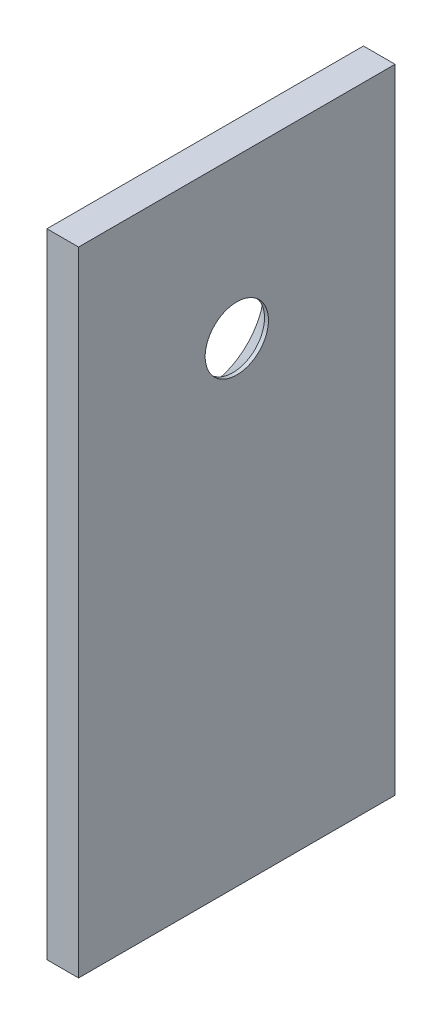
ISO-10303-21;
HEADER;
FILE_DESCRIPTION(('STEP AP214'),'2;1');
FILE_NAME('part.step','',(''),(''),'','','');
FILE_SCHEMA(('AUTOMOTIVE_DESIGN { 1 0 10303 214 1 1 1 1 }'));
ENDSEC;
DATA;
#1=APPLICATION_CONTEXT('core data for automotive mechanical design processes');
#2=APPLICATION_PROTOCOL_DEFINITION('international standard','automotive_design',2000,#1);
#3=PRODUCT_CONTEXT('',#1,'mechanical');
#4=PRODUCT('Part','Part','',(#3));
#5=PRODUCT_RELATED_PRODUCT_CATEGORY('part','',(#4));
#6=PRODUCT_DEFINITION_FORMATION('','',#4);
#7=PRODUCT_DEFINITION_CONTEXT('part definition',#1,'design');
#8=PRODUCT_DEFINITION('design','',#6,#7);
#9=PRODUCT_DEFINITION_SHAPE('','',#8);
#10=(LENGTH_UNIT() NAMED_UNIT(*) SI_UNIT(.MILLI.,.METRE.));
#11=(NAMED_UNIT(*) PLANE_ANGLE_UNIT() SI_UNIT($,.RADIAN.));
#12=(NAMED_UNIT(*) SI_UNIT($,.STERADIAN.) SOLID_ANGLE_UNIT());
#13=UNCERTAINTY_MEASURE_WITH_UNIT(LENGTH_MEASURE(1.E-05),#10,'distance_accuracy_value','');
#14=(GEOMETRIC_REPRESENTATION_CONTEXT(3) GLOBAL_UNCERTAINTY_ASSIGNED_CONTEXT((#13)) GLOBAL_UNIT_ASSIGNED_CONTEXT((#10,
#11,#12)) REPRESENTATION_CONTEXT('',''));
#15=CARTESIAN_POINT('',(0.,0.,0.));
#16=DIRECTION('',(0.,0.,1.));
#17=DIRECTION('',(1.,0.,0.));
#18=AXIS2_PLACEMENT_3D('',#15,#16,#17);
#19=CARTESIAN_POINT('',(4.,0.,0.));
#20=DIRECTION('',(1.,0.,0.));
#21=DIRECTION('',(0.,0.,-1.));
#22=AXIS2_PLACEMENT_3D('',#19,#20,#21);
#23=PLANE('',#22);
#24=DIRECTION('',(0.,1.,0.));
#25=VECTOR('',#24,1.);
#26=CARTESIAN_POINT('',(4.,-42.4999999999999,-20.));
#27=LINE('',#26,#25);
#28=CARTESIAN_POINT('',(4.,-122.5,-20.));
#29=VERTEX_POINT('',#28);
#30=CARTESIAN_POINT('',(4.,-42.4999999999999,-20.));
#31=VERTEX_POINT('',#30);
#32=EDGE_CURVE('E92',#29,#31,#27,.T.);
#33=ORIENTED_EDGE('',*,*,#32,.T.);
#34=DIRECTION('',(0.,0.,1.));
#35=VECTOR('',#34,1.);
#36=CARTESIAN_POINT('',(4.,-42.4999999999999,20.));
#37=LINE('',#36,#35);
#38=CARTESIAN_POINT('',(4.,-42.4999999999999,20.));
#39=VERTEX_POINT('',#38);
#40=EDGE_CURVE('E87',#31,#39,#37,.T.);
#41=ORIENTED_EDGE('',*,*,#40,.T.);
#42=DIRECTION('',(0.,-1.,0.));
#43=VECTOR('',#42,1.);
#44=CARTESIAN_POINT('',(4.,-42.4999999999999,20.));
#45=LINE('',#44,#43);
#46=CARTESIAN_POINT('',(4.,-122.5,20.));
#47=VERTEX_POINT('',#46);
#48=EDGE_CURVE('E90',#39,#47,#45,.T.);
#49=ORIENTED_EDGE('',*,*,#48,.T.);
#50=DIRECTION('',(0.,0.,-1.));
#51=VECTOR('',#50,1.);
#52=CARTESIAN_POINT('',(4.,-122.5,20.));
#53=LINE('',#52,#51);
#54=EDGE_CURVE('E56',#47,#29,#53,.T.);
#55=ORIENTED_EDGE('',*,*,#54,.T.);
#56=EDGE_LOOP('',(#33,#41,#49,#55));
#57=FACE_BOUND('',#56,.T.);
#58=CARTESIAN_POINT('',(4.,-62.4999999999999,0.));
#59=DIRECTION('',(1.,0.,0.));
#60=DIRECTION('',(0.,0.,-1.));
#61=AXIS2_PLACEMENT_3D('',#58,#59,#60);
#62=CIRCLE('',#61,4.);
#63=CARTESIAN_POINT('',(4.,-62.4999999999999,-4.));
#64=VERTEX_POINT('',#63);
#65=EDGE_CURVE('E115',#64,#64,#62,.T.);
#66=ORIENTED_EDGE('',*,*,#65,.F.);
#67=EDGE_LOOP('',(#66));
#68=FACE_BOUND('',#67,.T.);
#69=ADVANCED_FACE('F38',(#57,#68),#23,.T.);
#70=CARTESIAN_POINT('',(0.,0.,0.));
#71=DIRECTION('',(1.,0.,0.));
#72=DIRECTION('',(0.,0.,-1.));
#73=AXIS2_PLACEMENT_3D('',#70,#71,#72);
#74=PLANE('',#73);
#75=CARTESIAN_POINT('',(0.,-62.4999999999999,0.));
#76=DIRECTION('',(1.,0.,0.));
#77=DIRECTION('',(0.,0.,-1.));
#78=AXIS2_PLACEMENT_3D('',#75,#76,#77);
#79=CIRCLE('',#78,7.49999999999998);
#80=CARTESIAN_POINT('',(0.,-62.4999999999999,-7.49999999999997));
#81=VERTEX_POINT('',#80);
#82=EDGE_CURVE('E48',#81,#81,#79,.T.);
#83=ORIENTED_EDGE('',*,*,#82,.T.);
#84=EDGE_LOOP('',(#83));
#85=FACE_BOUND('',#84,.T.);
#86=DIRECTION('',(0.,1.,0.));
#87=VECTOR('',#86,1.);
#88=CARTESIAN_POINT('',(0.,-42.4999999999999,-20.));
#89=LINE('',#88,#87);
#90=CARTESIAN_POINT('',(0.,-122.5,-20.));
#91=VERTEX_POINT('',#90);
#92=CARTESIAN_POINT('',(0.,-42.4999999999999,-20.));
#93=VERTEX_POINT('',#92);
#94=EDGE_CURVE('E111',#91,#93,#89,.T.);
#95=ORIENTED_EDGE('',*,*,#94,.F.);
#96=DIRECTION('',(0.,0.,-1.));
#97=VECTOR('',#96,1.);
#98=CARTESIAN_POINT('',(0.,-122.5,20.));
#99=LINE('',#98,#97);
#100=CARTESIAN_POINT('',(0.,-122.5,20.));
#101=VERTEX_POINT('',#100);
#102=EDGE_CURVE('E79',#101,#91,#99,.T.);
#103=ORIENTED_EDGE('',*,*,#102,.F.);
#104=DIRECTION('',(0.,-1.,0.));
#105=VECTOR('',#104,1.);
#106=CARTESIAN_POINT('',(0.,-42.4999999999999,20.));
#107=LINE('',#106,#105);
#108=CARTESIAN_POINT('',(0.,-42.4999999999999,20.));
#109=VERTEX_POINT('',#108);
#110=EDGE_CURVE('E73',#109,#101,#107,.T.);
#111=ORIENTED_EDGE('',*,*,#110,.F.);
#112=DIRECTION('',(0.,0.,1.));
#113=VECTOR('',#112,1.);
#114=CARTESIAN_POINT('',(0.,-42.4999999999999,20.));
#115=LINE('',#114,#113);
#116=EDGE_CURVE('E98',#93,#109,#115,.T.);
#117=ORIENTED_EDGE('',*,*,#116,.F.);
#118=EDGE_LOOP('',(#95,#103,#111,#117));
#119=FACE_BOUND('',#118,.T.);
#120=ADVANCED_FACE('F131',(#85,#119),#74,.F.);
#121=CARTESIAN_POINT('',(4.,-42.4999999999999,-20.));
#122=DIRECTION('',(0.,0.,1.));
#123=DIRECTION('',(0.,-1.,0.));
#124=AXIS2_PLACEMENT_3D('',#121,#122,#123);
#125=PLANE('',#124);
#126=ORIENTED_EDGE('',*,*,#94,.T.);
#127=DIRECTION('',(-1.,0.,0.));
#128=VECTOR('',#127,1.);
#129=CARTESIAN_POINT('',(4.,-42.4999999999999,-20.));
#130=LINE('',#129,#128);
#131=EDGE_CURVE('E100',#31,#93,#130,.T.);
#132=ORIENTED_EDGE('',*,*,#131,.F.);
#133=ORIENTED_EDGE('',*,*,#32,.F.);
#134=DIRECTION('',(-1.,0.,0.));
#135=VECTOR('',#134,1.);
#136=CARTESIAN_POINT('',(4.,-122.5,-20.));
#137=LINE('',#136,#135);
#138=EDGE_CURVE('E107',#29,#91,#137,.T.);
#139=ORIENTED_EDGE('',*,*,#138,.T.);
#140=EDGE_LOOP('',(#126,#132,#133,#139));
#141=FACE_BOUND('',#140,.T.);
#142=ADVANCED_FACE('F151',(#141),#125,.F.);
#143=CARTESIAN_POINT('',(4.,-42.4999999999999,20.));
#144=DIRECTION('',(0.,-1.,0.));
#145=DIRECTION('',(0.,0.,-1.));
#146=AXIS2_PLACEMENT_3D('',#143,#144,#145);
#147=PLANE('',#146);
#148=ORIENTED_EDGE('',*,*,#116,.T.);
#149=DIRECTION('',(-1.,0.,0.));
#150=VECTOR('',#149,1.);
#151=CARTESIAN_POINT('',(4.,-42.4999999999999,20.));
#152=LINE('',#151,#150);
#153=EDGE_CURVE('E96',#39,#109,#152,.T.);
#154=ORIENTED_EDGE('',*,*,#153,.F.);
#155=ORIENTED_EDGE('',*,*,#40,.F.);
#156=ORIENTED_EDGE('',*,*,#131,.T.);
#157=EDGE_LOOP('',(#148,#154,#155,#156));
#158=FACE_BOUND('',#157,.T.);
#159=ADVANCED_FACE('F97',(#158),#147,.F.);
#160=CARTESIAN_POINT('',(4.,-42.4999999999999,20.));
#161=DIRECTION('',(0.,0.,-1.));
#162=DIRECTION('',(0.,1.,0.));
#163=AXIS2_PLACEMENT_3D('',#160,#161,#162);
#164=PLANE('',#163);
#165=ORIENTED_EDGE('',*,*,#110,.T.);
#166=DIRECTION('',(-1.,0.,0.));
#167=VECTOR('',#166,1.);
#168=CARTESIAN_POINT('',(4.,-122.5,20.));
#169=LINE('',#168,#167);
#170=EDGE_CURVE('E101',#47,#101,#169,.T.);
#171=ORIENTED_EDGE('',*,*,#170,.F.);
#172=ORIENTED_EDGE('',*,*,#48,.F.);
#173=ORIENTED_EDGE('',*,*,#153,.T.);
#174=EDGE_LOOP('',(#165,#171,#172,#173));
#175=FACE_BOUND('',#174,.T.);
#176=ADVANCED_FACE('F103',(#175),#164,.F.);
#177=CARTESIAN_POINT('',(4.,-122.5,20.));
#178=DIRECTION('',(0.,1.,0.));
#179=DIRECTION('',(0.,0.,1.));
#180=AXIS2_PLACEMENT_3D('',#177,#178,#179);
#181=PLANE('',#180);
#182=ORIENTED_EDGE('',*,*,#102,.T.);
#183=ORIENTED_EDGE('',*,*,#138,.F.);
#184=ORIENTED_EDGE('',*,*,#54,.F.);
#185=ORIENTED_EDGE('',*,*,#170,.T.);
#186=EDGE_LOOP('',(#182,#183,#184,#185));
#187=FACE_BOUND('',#186,.T.);
#188=ADVANCED_FACE('F141',(#187),#181,.F.);
#189=CARTESIAN_POINT('',(4.,-62.4999999999999,0.));
#190=DIRECTION('',(-1.,0.,0.));
#191=DIRECTION('',(0.,0.,1.));
#192=AXIS2_PLACEMENT_3D('',#189,#190,#191);
#193=CYLINDRICAL_SURFACE('',#192,4.);
#194=CARTESIAN_POINT('',(3.49999999999999,-62.4999999999999,0.));
#195=DIRECTION('',(1.,0.,0.));
#196=DIRECTION('',(0.,0.,-1.));
#197=AXIS2_PLACEMENT_3D('',#194,#195,#196);
#198=CIRCLE('',#197,4.);
#199=CARTESIAN_POINT('',(3.49999999999999,-62.4999999999999,-4.));
#200=VERTEX_POINT('',#199);
#201=EDGE_CURVE('E11',#200,#200,#198,.F.);
#202=ORIENTED_EDGE('',*,*,#201,.T.);
#203=EDGE_LOOP('',(#202));
#204=FACE_BOUND('',#203,.T.);
#205=ORIENTED_EDGE('',*,*,#65,.T.);
#206=EDGE_LOOP('',(#205));
#207=FACE_BOUND('',#206,.T.);
#208=ADVANCED_FACE('F135',(#204,#207),#193,.F.);
#209=CARTESIAN_POINT('',(0.,-62.4999999999999,0.));
#210=DIRECTION('',(-1.,0.,0.));
#211=DIRECTION('',(0.,0.,1.));
#212=AXIS2_PLACEMENT_3D('',#209,#210,#211);
#213=CONICAL_SURFACE('',#212,7.49999999999998,0.785398163397446);
#214=ORIENTED_EDGE('',*,*,#201,.F.);
#215=EDGE_LOOP('',(#214));
#216=FACE_BOUND('',#215,.T.);
#217=ORIENTED_EDGE('',*,*,#82,.F.);
#218=EDGE_LOOP('',(#217));
#219=FACE_BOUND('',#218,.T.);
#220=ADVANCED_FACE('F40',(#216,#219),#213,.F.);
#221=CLOSED_SHELL('',(#69,#120,#142,#159,#176,#188,#208,#220));
#222=MANIFOLD_SOLID_BREP('B2',#221);
#223=ADVANCED_BREP_SHAPE_REPRESENTATION('',(#18,#222),#14);
#224=SHAPE_DEFINITION_REPRESENTATION(#9,#223);
ENDSEC;
END-ISO-10303-21;
